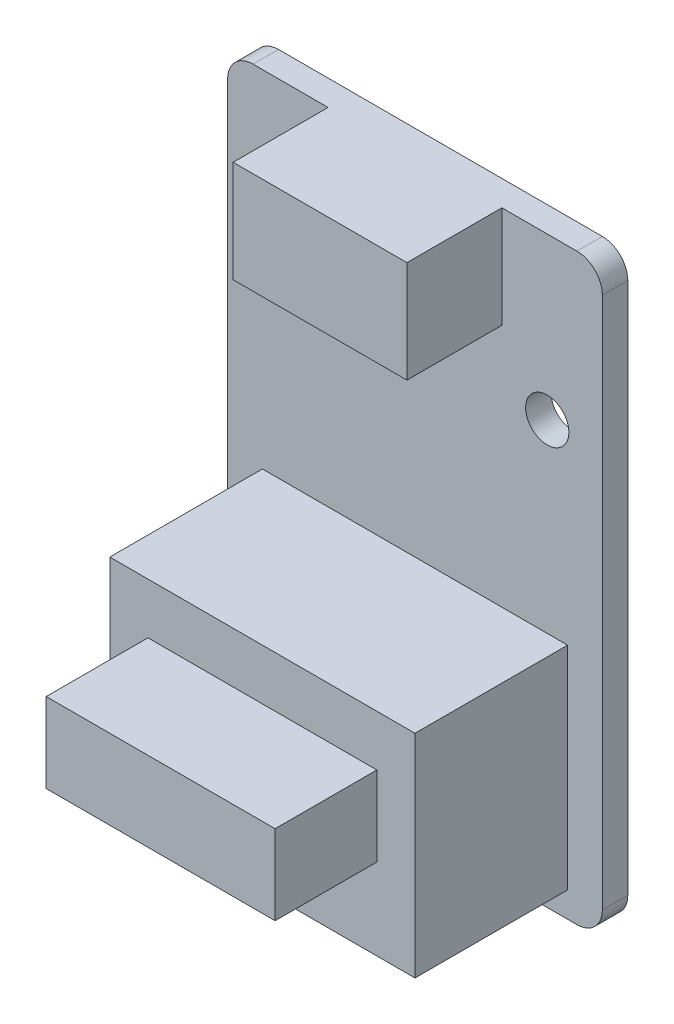
ISO-10303-21;
HEADER;
FILE_DESCRIPTION(('STEP AP214'),'2;1');
FILE_NAME('part.step','',(''),(''),'','','');
FILE_SCHEMA(('AUTOMOTIVE_DESIGN { 1 0 10303 214 1 1 1 1 }'));
ENDSEC;
DATA;
#1=APPLICATION_CONTEXT('core data for automotive mechanical design processes');
#2=APPLICATION_PROTOCOL_DEFINITION('international standard','automotive_design',2000,#1);
#3=PRODUCT_CONTEXT('',#1,'mechanical');
#4=PRODUCT('Part','Part','',(#3));
#5=PRODUCT_RELATED_PRODUCT_CATEGORY('part','',(#4));
#6=PRODUCT_DEFINITION_FORMATION('','',#4);
#7=PRODUCT_DEFINITION_CONTEXT('part definition',#1,'design');
#8=PRODUCT_DEFINITION('design','',#6,#7);
#9=PRODUCT_DEFINITION_SHAPE('','',#8);
#10=(LENGTH_UNIT() NAMED_UNIT(*) SI_UNIT(.MILLI.,.METRE.));
#11=(NAMED_UNIT(*) PLANE_ANGLE_UNIT() SI_UNIT($,.RADIAN.));
#12=(NAMED_UNIT(*) SI_UNIT($,.STERADIAN.) SOLID_ANGLE_UNIT());
#13=UNCERTAINTY_MEASURE_WITH_UNIT(LENGTH_MEASURE(1.E-05),#10,'distance_accuracy_value','');
#14=(GEOMETRIC_REPRESENTATION_CONTEXT(3) GLOBAL_UNCERTAINTY_ASSIGNED_CONTEXT((#13)) GLOBAL_UNIT_ASSIGNED_CONTEXT((#10,
#11,#12)) REPRESENTATION_CONTEXT('',''));
#15=CARTESIAN_POINT('',(0.,0.,0.));
#16=DIRECTION('',(0.,0.,1.));
#17=DIRECTION('',(1.,0.,0.));
#18=AXIS2_PLACEMENT_3D('',#15,#16,#17);
#19=CARTESIAN_POINT('',(12.3394044605913,-91.6442356585348,1.5));
#20=DIRECTION('',(0.,0.,1.));
#21=DIRECTION('',(1.,0.,0.));
#22=AXIS2_PLACEMENT_3D('',#19,#20,#21);
#23=PLANE('',#22);
#24=CARTESIAN_POINT('',(-5.01059553940872,-68.2442356585348,1.5));
#25=DIRECTION('',(0.,0.,1.));
#26=DIRECTION('',(1.,0.,0.));
#27=AXIS2_PLACEMENT_3D('',#24,#25,#26);
#28=CIRCLE('',#27,1.27499999999999);
#29=CARTESIAN_POINT('',(-3.73559553940873,-68.2442356585348,1.5));
#30=VERTEX_POINT('',#29);
#31=EDGE_CURVE('E356',#30,#30,#28,.T.);
#32=ORIENTED_EDGE('',*,*,#31,.F.);
#33=EDGE_LOOP('',(#32));
#34=FACE_BOUND('',#33,.T.);
#35=CARTESIAN_POINT('',(10.5894044605913,-68.2442356585348,1.5));
#36=DIRECTION('',(0.,0.,1.));
#37=DIRECTION('',(1.,0.,0.));
#38=AXIS2_PLACEMENT_3D('',#35,#36,#37);
#39=CIRCLE('',#38,1.27499999999999);
#40=CARTESIAN_POINT('',(11.8644044605913,-68.2442356585348,1.5));
#41=VERTEX_POINT('',#40);
#42=EDGE_CURVE('E350',#41,#41,#39,.T.);
#43=ORIENTED_EDGE('',*,*,#42,.F.);
#44=EDGE_LOOP('',(#43));
#45=FACE_BOUND('',#44,.T.);
#46=DIRECTION('',(0.,-1.,0.));
#47=VECTOR('',#46,1.);
#48=CARTESIAN_POINT('',(-6.21059553940872,-79.1442356585348,1.5));
#49=LINE('',#48,#47);
#50=CARTESIAN_POINT('',(-6.21059553940872,-79.1442356585348,1.5));
#51=VERTEX_POINT('',#50);
#52=CARTESIAN_POINT('',(-6.21059553940871,-91.6442356585348,1.5));
#53=VERTEX_POINT('',#52);
#54=EDGE_CURVE('E229',#51,#53,#49,.T.);
#55=ORIENTED_EDGE('',*,*,#54,.F.);
#56=DIRECTION('',(-1.,0.,0.));
#57=VECTOR('',#56,1.);
#58=CARTESIAN_POINT('',(-6.21059553940872,-79.1442356585348,1.5));
#59=LINE('',#58,#57);
#60=CARTESIAN_POINT('',(11.7894044605913,-79.1442356585348,1.5));
#61=VERTEX_POINT('',#60);
#62=EDGE_CURVE('E234',#61,#51,#59,.T.);
#63=ORIENTED_EDGE('',*,*,#62,.F.);
#64=DIRECTION('',(0.,1.,0.));
#65=VECTOR('',#64,1.);
#66=CARTESIAN_POINT('',(11.7894044605913,-79.1442356585348,1.5));
#67=LINE('',#66,#65);
#68=CARTESIAN_POINT('',(11.7894044605913,-91.6442356585348,1.5));
#69=VERTEX_POINT('',#68);
#70=EDGE_CURVE('E246',#69,#61,#67,.T.);
#71=ORIENTED_EDGE('',*,*,#70,.F.);
#72=DIRECTION('',(1.,0.,0.));
#73=VECTOR('',#72,1.);
#74=CARTESIAN_POINT('',(-6.21059553940871,-91.6442356585348,1.5));
#75=LINE('',#74,#73);
#76=EDGE_CURVE('E243',#53,#69,#75,.T.);
#77=ORIENTED_EDGE('',*,*,#76,.F.);
#78=EDGE_LOOP('',(#55,#63,#71,#77));
#79=FACE_BOUND('',#78,.T.);
#80=DIRECTION('',(1.,0.,0.));
#81=VECTOR('',#80,1.);
#82=CARTESIAN_POINT('',(-2.33559553940872,-64.7442356585348,1.5));
#83=LINE('',#82,#81);
#84=CARTESIAN_POINT('',(-2.33559553940872,-64.7442356585348,1.5));
#85=VERTEX_POINT('',#84);
#86=CARTESIAN_POINT('',(7.91440446059128,-64.7442356585348,1.5));
#87=VERTEX_POINT('',#86);
#88=EDGE_CURVE('E48',#85,#87,#83,.T.);
#89=ORIENTED_EDGE('',*,*,#88,.F.);
#90=DIRECTION('',(0.,-1.,0.));
#91=VECTOR('',#90,1.);
#92=CARTESIAN_POINT('',(-2.33559553940872,-58.7442356585348,1.5));
#93=LINE('',#92,#91);
#94=CARTESIAN_POINT('',(-2.33559553940872,-58.7442356585348,1.5));
#95=VERTEX_POINT('',#94);
#96=EDGE_CURVE('E190',#95,#85,#93,.T.);
#97=ORIENTED_EDGE('',*,*,#96,.F.);
#98=DIRECTION('',(-1.,0.,0.));
#99=VECTOR('',#98,1.);
#100=CARTESIAN_POINT('',(-6.76059553940871,-58.7442356585348,1.5));
#101=LINE('',#100,#99);
#102=CARTESIAN_POINT('',(-6.76059553940871,-58.7442356585348,1.5));
#103=VERTEX_POINT('',#102);
#104=EDGE_CURVE('E271',#95,#103,#101,.T.);
#105=ORIENTED_EDGE('',*,*,#104,.T.);
#106=CARTESIAN_POINT('',(-6.76059553940872,-60.2442356585348,1.5));
#107=DIRECTION('',(0.,0.,1.));
#108=DIRECTION('',(1.,0.,0.));
#109=AXIS2_PLACEMENT_3D('',#106,#107,#108);
#110=CIRCLE('',#109,1.5);
#111=CARTESIAN_POINT('',(-8.26059553940872,-60.2442356585348,1.5));
#112=VERTEX_POINT('',#111);
#113=EDGE_CURVE('E274',#103,#112,#110,.T.);
#114=ORIENTED_EDGE('',*,*,#113,.T.);
#115=DIRECTION('',(0.,-1.,0.));
#116=VECTOR('',#115,1.);
#117=CARTESIAN_POINT('',(-8.26059553940872,-60.2442356585348,1.5));
#118=LINE('',#117,#116);
#119=CARTESIAN_POINT('',(-8.26059553940872,-91.6442356585348,1.5));
#120=VERTEX_POINT('',#119);
#121=EDGE_CURVE('E276',#112,#120,#118,.T.);
#122=ORIENTED_EDGE('',*,*,#121,.T.);
#123=CARTESIAN_POINT('',(-6.76059553940872,-91.6442356585348,1.5));
#124=DIRECTION('',(0.,0.,1.));
#125=DIRECTION('',(1.,0.,0.));
#126=AXIS2_PLACEMENT_3D('',#123,#124,#125);
#127=CIRCLE('',#126,1.5);
#128=CARTESIAN_POINT('',(-6.76059553940871,-93.1442356585348,1.5));
#129=VERTEX_POINT('',#128);
#130=EDGE_CURVE('E278',#120,#129,#127,.T.);
#131=ORIENTED_EDGE('',*,*,#130,.T.);
#132=DIRECTION('',(1.,0.,0.));
#133=VECTOR('',#132,1.);
#134=CARTESIAN_POINT('',(-6.76059553940871,-93.1442356585348,1.5));
#135=LINE('',#134,#133);
#136=CARTESIAN_POINT('',(12.3394044605913,-93.1442356585348,1.5));
#137=VERTEX_POINT('',#136);
#138=EDGE_CURVE('E280',#129,#137,#135,.T.);
#139=ORIENTED_EDGE('',*,*,#138,.T.);
#140=CARTESIAN_POINT('',(12.3394044605913,-91.6442356585348,1.5));
#141=DIRECTION('',(0.,0.,1.));
#142=DIRECTION('',(1.,0.,0.));
#143=AXIS2_PLACEMENT_3D('',#140,#141,#142);
#144=CIRCLE('',#143,1.5);
#145=CARTESIAN_POINT('',(13.8394044605913,-91.6442356585348,1.5));
#146=VERTEX_POINT('',#145);
#147=EDGE_CURVE('E263',#137,#146,#144,.T.);
#148=ORIENTED_EDGE('',*,*,#147,.T.);
#149=DIRECTION('',(0.,1.,0.));
#150=VECTOR('',#149,1.);
#151=CARTESIAN_POINT('',(13.8394044605913,-60.2442356585348,1.5));
#152=LINE('',#151,#150);
#153=CARTESIAN_POINT('',(13.8394044605913,-60.2442356585348,1.5));
#154=VERTEX_POINT('',#153);
#155=EDGE_CURVE('E266',#146,#154,#152,.T.);
#156=ORIENTED_EDGE('',*,*,#155,.T.);
#157=CARTESIAN_POINT('',(12.3394044605913,-60.2442356585348,1.5));
#158=DIRECTION('',(0.,0.,1.));
#159=DIRECTION('',(-1.,0.,0.));
#160=AXIS2_PLACEMENT_3D('',#157,#158,#159);
#161=CIRCLE('',#160,1.5);
#162=CARTESIAN_POINT('',(12.3394044605913,-58.7442356585348,1.5));
#163=VERTEX_POINT('',#162);
#164=EDGE_CURVE('E269',#154,#163,#161,.T.);
#165=ORIENTED_EDGE('',*,*,#164,.T.);
#166=CARTESIAN_POINT('',(7.91440446059128,-58.7442356585348,1.5));
#167=VERTEX_POINT('',#166);
#168=EDGE_CURVE('E272',#163,#167,#101,.T.);
#169=ORIENTED_EDGE('',*,*,#168,.T.);
#170=DIRECTION('',(0.,1.,0.));
#171=VECTOR('',#170,1.);
#172=CARTESIAN_POINT('',(7.91440446059128,-58.7442356585348,1.5));
#173=LINE('',#172,#171);
#174=EDGE_CURVE('E53',#87,#167,#173,.T.);
#175=ORIENTED_EDGE('',*,*,#174,.F.);
#176=EDGE_LOOP('',(#89,#97,#105,#114,#122,#131,#139,#148,#156,#165,#169,#175));
#177=FACE_BOUND('',#176,.T.);
#178=ADVANCED_FACE('F33',(#34,#45,#79,#177),#23,.T.);
#179=CARTESIAN_POINT('',(12.3394044605913,-91.6442356585348,1.5));
#180=DIRECTION('',(0.,0.,-1.));
#181=DIRECTION('',(-1.,0.,0.));
#182=AXIS2_PLACEMENT_3D('',#179,#180,#181);
#183=CYLINDRICAL_SURFACE('',#182,1.5);
#184=CARTESIAN_POINT('',(12.3394044605913,-91.6442356585348,0.));
#185=DIRECTION('',(0.,0.,1.));
#186=DIRECTION('',(1.,0.,0.));
#187=AXIS2_PLACEMENT_3D('',#184,#185,#186);
#188=CIRCLE('',#187,1.5);
#189=CARTESIAN_POINT('',(12.3394044605913,-93.1442356585348,0.));
#190=VERTEX_POINT('',#189);
#191=CARTESIAN_POINT('',(13.8394044605913,-91.6442356585348,0.));
#192=VERTEX_POINT('',#191);
#193=EDGE_CURVE('E262',#190,#192,#188,.T.);
#194=ORIENTED_EDGE('',*,*,#193,.T.);
#195=DIRECTION('',(0.,0.,-1.));
#196=VECTOR('',#195,1.);
#197=CARTESIAN_POINT('',(13.8394044605913,-91.6442356585348,1.5));
#198=LINE('',#197,#196);
#199=EDGE_CURVE('E11',#146,#192,#198,.T.);
#200=ORIENTED_EDGE('',*,*,#199,.F.);
#201=ORIENTED_EDGE('',*,*,#147,.F.);
#202=DIRECTION('',(0.,0.,-1.));
#203=VECTOR('',#202,1.);
#204=CARTESIAN_POINT('',(12.3394044605913,-93.1442356585348,1.5));
#205=LINE('',#204,#203);
#206=EDGE_CURVE('E282',#137,#190,#205,.T.);
#207=ORIENTED_EDGE('',*,*,#206,.T.);
#208=EDGE_LOOP('',(#194,#200,#201,#207));
#209=FACE_BOUND('',#208,.T.);
#210=ADVANCED_FACE('F35',(#209),#183,.T.);
#211=CARTESIAN_POINT('',(13.8394044605913,-60.2442356585348,1.5));
#212=DIRECTION('',(-1.,0.,0.));
#213=DIRECTION('',(0.,-1.,0.));
#214=AXIS2_PLACEMENT_3D('',#211,#212,#213);
#215=PLANE('',#214);
#216=DIRECTION('',(0.,1.,0.));
#217=VECTOR('',#216,1.);
#218=CARTESIAN_POINT('',(13.8394044605913,-60.2442356585348,0.));
#219=LINE('',#218,#217);
#220=CARTESIAN_POINT('',(13.8394044605913,-60.2442356585348,0.));
#221=VERTEX_POINT('',#220);
#222=EDGE_CURVE('E285',#192,#221,#219,.T.);
#223=ORIENTED_EDGE('',*,*,#222,.T.);
#224=DIRECTION('',(0.,0.,-1.));
#225=VECTOR('',#224,1.);
#226=CARTESIAN_POINT('',(13.8394044605913,-60.2442356585348,1.5));
#227=LINE('',#226,#225);
#228=EDGE_CURVE('E41',#154,#221,#227,.T.);
#229=ORIENTED_EDGE('',*,*,#228,.F.);
#230=ORIENTED_EDGE('',*,*,#155,.F.);
#231=ORIENTED_EDGE('',*,*,#199,.T.);
#232=EDGE_LOOP('',(#223,#229,#230,#231));
#233=FACE_BOUND('',#232,.T.);
#234=ADVANCED_FACE('F414',(#233),#215,.F.);
#235=CARTESIAN_POINT('',(12.3394044605913,-60.2442356585348,1.5));
#236=DIRECTION('',(0.,0.,-1.));
#237=DIRECTION('',(-1.,0.,0.));
#238=AXIS2_PLACEMENT_3D('',#235,#236,#237);
#239=CYLINDRICAL_SURFACE('',#238,1.5);
#240=CARTESIAN_POINT('',(12.3394044605913,-60.2442356585348,0.));
#241=DIRECTION('',(0.,0.,1.));
#242=DIRECTION('',(-1.,0.,0.));
#243=AXIS2_PLACEMENT_3D('',#240,#241,#242);
#244=CIRCLE('',#243,1.5);
#245=CARTESIAN_POINT('',(12.3394044605913,-58.7442356585348,0.));
#246=VERTEX_POINT('',#245);
#247=EDGE_CURVE('E287',#221,#246,#244,.T.);
#248=ORIENTED_EDGE('',*,*,#247,.T.);
#249=DIRECTION('',(0.,0.,-1.));
#250=VECTOR('',#249,1.);
#251=CARTESIAN_POINT('',(12.3394044605913,-58.7442356585348,1.5));
#252=LINE('',#251,#250);
#253=EDGE_CURVE('E312',#163,#246,#252,.T.);
#254=ORIENTED_EDGE('',*,*,#253,.F.);
#255=ORIENTED_EDGE('',*,*,#164,.F.);
#256=ORIENTED_EDGE('',*,*,#228,.T.);
#257=EDGE_LOOP('',(#248,#254,#255,#256));
#258=FACE_BOUND('',#257,.T.);
#259=ADVANCED_FACE('F319',(#258),#239,.T.);
#260=CARTESIAN_POINT('',(-6.76059553940871,-58.7442356585348,1.5));
#261=DIRECTION('',(0.,-1.,0.));
#262=DIRECTION('',(0.,0.,-1.));
#263=AXIS2_PLACEMENT_3D('',#260,#261,#262);
#264=PLANE('',#263);
#265=DIRECTION('',(-1.,0.,0.));
#266=VECTOR('',#265,1.);
#267=CARTESIAN_POINT('',(-6.76059553940871,-58.7442356585348,0.));
#268=LINE('',#267,#266);
#269=CARTESIAN_POINT('',(-6.76059553940871,-58.7442356585348,0.));
#270=VERTEX_POINT('',#269);
#271=EDGE_CURVE('E289',#246,#270,#268,.T.);
#272=ORIENTED_EDGE('',*,*,#271,.T.);
#273=DIRECTION('',(0.,0.,-1.));
#274=VECTOR('',#273,1.);
#275=CARTESIAN_POINT('',(-6.76059553940871,-58.7442356585348,1.5));
#276=LINE('',#275,#274);
#277=EDGE_CURVE('E309',#103,#270,#276,.T.);
#278=ORIENTED_EDGE('',*,*,#277,.F.);
#279=ORIENTED_EDGE('',*,*,#104,.F.);
#280=DIRECTION('',(0.,0.,-1.));
#281=VECTOR('',#280,1.);
#282=CARTESIAN_POINT('',(-2.33559553940872,-58.7442356585348,7.1));
#283=LINE('',#282,#281);
#284=CARTESIAN_POINT('',(-2.33559553940872,-58.7442356585348,7.1));
#285=VERTEX_POINT('',#284);
#286=EDGE_CURVE('E338',#285,#95,#283,.T.);
#287=ORIENTED_EDGE('',*,*,#286,.F.);
#288=DIRECTION('',(-1.,0.,0.));
#289=VECTOR('',#288,1.);
#290=CARTESIAN_POINT('',(-2.33559553940872,-58.7442356585348,7.1));
#291=LINE('',#290,#289);
#292=CARTESIAN_POINT('',(7.91440446059128,-58.7442356585348,7.1));
#293=VERTEX_POINT('',#292);
#294=EDGE_CURVE('E184',#293,#285,#291,.T.);
#295=ORIENTED_EDGE('',*,*,#294,.F.);
#296=DIRECTION('',(0.,0.,-1.));
#297=VECTOR('',#296,1.);
#298=CARTESIAN_POINT('',(7.91440446059128,-58.7442356585348,7.1));
#299=LINE('',#298,#297);
#300=EDGE_CURVE('E196',#293,#167,#299,.T.);
#301=ORIENTED_EDGE('',*,*,#300,.T.);
#302=ORIENTED_EDGE('',*,*,#168,.F.);
#303=ORIENTED_EDGE('',*,*,#253,.T.);
#304=EDGE_LOOP('',(#272,#278,#279,#287,#295,#301,#302,#303));
#305=FACE_BOUND('',#304,.T.);
#306=ADVANCED_FACE('F330',(#305),#264,.F.);
#307=CARTESIAN_POINT('',(-6.76059553940872,-60.2442356585348,1.5));
#308=DIRECTION('',(0.,0.,-1.));
#309=DIRECTION('',(-1.,0.,0.));
#310=AXIS2_PLACEMENT_3D('',#307,#308,#309);
#311=CYLINDRICAL_SURFACE('',#310,1.5);
#312=CARTESIAN_POINT('',(-6.76059553940872,-60.2442356585348,0.));
#313=DIRECTION('',(0.,0.,1.));
#314=DIRECTION('',(1.,0.,0.));
#315=AXIS2_PLACEMENT_3D('',#312,#313,#314);
#316=CIRCLE('',#315,1.5);
#317=CARTESIAN_POINT('',(-8.26059553940872,-60.2442356585348,0.));
#318=VERTEX_POINT('',#317);
#319=EDGE_CURVE('E291',#270,#318,#316,.T.);
#320=ORIENTED_EDGE('',*,*,#319,.T.);
#321=DIRECTION('',(0.,0.,-1.));
#322=VECTOR('',#321,1.);
#323=CARTESIAN_POINT('',(-8.26059553940872,-60.2442356585348,1.5));
#324=LINE('',#323,#322);
#325=EDGE_CURVE('E306',#112,#318,#324,.T.);
#326=ORIENTED_EDGE('',*,*,#325,.F.);
#327=ORIENTED_EDGE('',*,*,#113,.F.);
#328=ORIENTED_EDGE('',*,*,#277,.T.);
#329=EDGE_LOOP('',(#320,#326,#327,#328));
#330=FACE_BOUND('',#329,.T.);
#331=ADVANCED_FACE('F334',(#330),#311,.T.);
#332=CARTESIAN_POINT('',(-8.26059553940872,-60.2442356585348,1.5));
#333=DIRECTION('',(1.,0.,0.));
#334=DIRECTION('',(0.,1.,0.));
#335=AXIS2_PLACEMENT_3D('',#332,#333,#334);
#336=PLANE('',#335);
#337=DIRECTION('',(0.,-1.,0.));
#338=VECTOR('',#337,1.);
#339=CARTESIAN_POINT('',(-8.26059553940872,-60.2442356585348,0.));
#340=LINE('',#339,#338);
#341=CARTESIAN_POINT('',(-8.26059553940872,-91.6442356585348,0.));
#342=VERTEX_POINT('',#341);
#343=EDGE_CURVE('E293',#318,#342,#340,.T.);
#344=ORIENTED_EDGE('',*,*,#343,.T.);
#345=DIRECTION('',(0.,0.,-1.));
#346=VECTOR('',#345,1.);
#347=CARTESIAN_POINT('',(-8.26059553940872,-91.6442356585348,1.5));
#348=LINE('',#347,#346);
#349=EDGE_CURVE('E303',#120,#342,#348,.T.);
#350=ORIENTED_EDGE('',*,*,#349,.F.);
#351=ORIENTED_EDGE('',*,*,#121,.F.);
#352=ORIENTED_EDGE('',*,*,#325,.T.);
#353=EDGE_LOOP('',(#344,#350,#351,#352));
#354=FACE_BOUND('',#353,.T.);
#355=ADVANCED_FACE('F404',(#354),#336,.F.);
#356=CARTESIAN_POINT('',(-6.76059553940872,-91.6442356585348,1.5));
#357=DIRECTION('',(0.,0.,-1.));
#358=DIRECTION('',(-1.,0.,0.));
#359=AXIS2_PLACEMENT_3D('',#356,#357,#358);
#360=CYLINDRICAL_SURFACE('',#359,1.5);
#361=CARTESIAN_POINT('',(-6.76059553940872,-91.6442356585348,0.));
#362=DIRECTION('',(0.,0.,1.));
#363=DIRECTION('',(1.,0.,0.));
#364=AXIS2_PLACEMENT_3D('',#361,#362,#363);
#365=CIRCLE('',#364,1.5);
#366=CARTESIAN_POINT('',(-6.76059553940871,-93.1442356585348,0.));
#367=VERTEX_POINT('',#366);
#368=EDGE_CURVE('E295',#342,#367,#365,.T.);
#369=ORIENTED_EDGE('',*,*,#368,.T.);
#370=DIRECTION('',(0.,0.,-1.));
#371=VECTOR('',#370,1.);
#372=CARTESIAN_POINT('',(-6.76059553940871,-93.1442356585348,1.5));
#373=LINE('',#372,#371);
#374=EDGE_CURVE('E300',#129,#367,#373,.T.);
#375=ORIENTED_EDGE('',*,*,#374,.F.);
#376=ORIENTED_EDGE('',*,*,#130,.F.);
#377=ORIENTED_EDGE('',*,*,#349,.T.);
#378=EDGE_LOOP('',(#369,#375,#376,#377));
#379=FACE_BOUND('',#378,.T.);
#380=ADVANCED_FACE('F400',(#379),#360,.T.);
#381=CARTESIAN_POINT('',(-6.76059553940871,-93.1442356585348,1.5));
#382=DIRECTION('',(0.,1.,0.));
#383=DIRECTION('',(0.,0.,1.));
#384=AXIS2_PLACEMENT_3D('',#381,#382,#383);
#385=PLANE('',#384);
#386=DIRECTION('',(1.,0.,0.));
#387=VECTOR('',#386,1.);
#388=CARTESIAN_POINT('',(-6.76059553940871,-93.1442356585348,0.));
#389=LINE('',#388,#387);
#390=EDGE_CURVE('E267',#367,#190,#389,.T.);
#391=ORIENTED_EDGE('',*,*,#390,.T.);
#392=ORIENTED_EDGE('',*,*,#206,.F.);
#393=ORIENTED_EDGE('',*,*,#138,.F.);
#394=ORIENTED_EDGE('',*,*,#374,.T.);
#395=EDGE_LOOP('',(#391,#392,#393,#394));
#396=FACE_BOUND('',#395,.T.);
#397=ADVANCED_FACE('F396',(#396),#385,.F.);
#398=CARTESIAN_POINT('',(12.3394044605913,-91.6442356585348,0.));
#399=DIRECTION('',(0.,0.,1.));
#400=DIRECTION('',(1.,0.,0.));
#401=AXIS2_PLACEMENT_3D('',#398,#399,#400);
#402=PLANE('',#401);
#403=CARTESIAN_POINT('',(-5.01059553940872,-68.2442356585348,0.));
#404=DIRECTION('',(0.,0.,1.));
#405=DIRECTION('',(1.,0.,0.));
#406=AXIS2_PLACEMENT_3D('',#403,#404,#405);
#407=CIRCLE('',#406,1.275);
#408=CARTESIAN_POINT('',(-3.73559553940872,-68.2442356585348,0.));
#409=VERTEX_POINT('',#408);
#410=EDGE_CURVE('E353',#409,#409,#407,.T.);
#411=ORIENTED_EDGE('',*,*,#410,.T.);
#412=EDGE_LOOP('',(#411));
#413=FACE_BOUND('',#412,.T.);
#414=CARTESIAN_POINT('',(10.5894044605913,-68.2442356585348,0.));
#415=DIRECTION('',(0.,0.,1.));
#416=DIRECTION('',(1.,0.,0.));
#417=AXIS2_PLACEMENT_3D('',#414,#415,#416);
#418=CIRCLE('',#417,1.275);
#419=CARTESIAN_POINT('',(11.8644044605913,-68.2442356585348,0.));
#420=VERTEX_POINT('',#419);
#421=EDGE_CURVE('E345',#420,#420,#418,.T.);
#422=ORIENTED_EDGE('',*,*,#421,.T.);
#423=EDGE_LOOP('',(#422));
#424=FACE_BOUND('',#423,.T.);
#425=ORIENTED_EDGE('',*,*,#193,.F.);
#426=ORIENTED_EDGE('',*,*,#390,.F.);
#427=ORIENTED_EDGE('',*,*,#368,.F.);
#428=ORIENTED_EDGE('',*,*,#343,.F.);
#429=ORIENTED_EDGE('',*,*,#319,.F.);
#430=ORIENTED_EDGE('',*,*,#271,.F.);
#431=ORIENTED_EDGE('',*,*,#247,.F.);
#432=ORIENTED_EDGE('',*,*,#222,.F.);
#433=EDGE_LOOP('',(#425,#426,#427,#428,#429,#430,#431,#432));
#434=FACE_BOUND('',#433,.T.);
#435=ADVANCED_FACE('F325',(#413,#424,#434),#402,.F.);
#436=CARTESIAN_POINT('',(-6.21059553940872,-79.1442356585348,10.5));
#437=DIRECTION('',(1.,0.,0.));
#438=DIRECTION('',(0.,1.,0.));
#439=AXIS2_PLACEMENT_3D('',#436,#437,#438);
#440=PLANE('',#439);
#441=ORIENTED_EDGE('',*,*,#54,.T.);
#442=DIRECTION('',(0.,0.,-1.));
#443=VECTOR('',#442,1.);
#444=CARTESIAN_POINT('',(-6.21059553940871,-91.6442356585348,10.5));
#445=LINE('',#444,#443);
#446=CARTESIAN_POINT('',(-6.21059553940871,-91.6442356585348,10.5));
#447=VERTEX_POINT('',#446);
#448=EDGE_CURVE('E259',#447,#53,#445,.T.);
#449=ORIENTED_EDGE('',*,*,#448,.F.);
#450=DIRECTION('',(0.,-1.,0.));
#451=VECTOR('',#450,1.);
#452=CARTESIAN_POINT('',(-6.21059553940872,-79.1442356585348,10.5));
#453=LINE('',#452,#451);
#454=CARTESIAN_POINT('',(-6.21059553940872,-79.1442356585348,10.5));
#455=VERTEX_POINT('',#454);
#456=EDGE_CURVE('E230',#455,#447,#453,.T.);
#457=ORIENTED_EDGE('',*,*,#456,.F.);
#458=DIRECTION('',(0.,0.,-1.));
#459=VECTOR('',#458,1.);
#460=CARTESIAN_POINT('',(-6.21059553940872,-79.1442356585348,10.5));
#461=LINE('',#460,#459);
#462=EDGE_CURVE('E240',#455,#51,#461,.T.);
#463=ORIENTED_EDGE('',*,*,#462,.T.);
#464=EDGE_LOOP('',(#441,#449,#457,#463));
#465=FACE_BOUND('',#464,.T.);
#466=ADVANCED_FACE('F375',(#465),#440,.F.);
#467=CARTESIAN_POINT('',(-6.21059553940871,-91.6442356585348,10.5));
#468=DIRECTION('',(0.,1.,0.));
#469=DIRECTION('',(0.,0.,1.));
#470=AXIS2_PLACEMENT_3D('',#467,#468,#469);
#471=PLANE('',#470);
#472=ORIENTED_EDGE('',*,*,#76,.T.);
#473=DIRECTION('',(0.,0.,-1.));
#474=VECTOR('',#473,1.);
#475=CARTESIAN_POINT('',(11.7894044605913,-91.6442356585348,10.5));
#476=LINE('',#475,#474);
#477=CARTESIAN_POINT('',(11.7894044605913,-91.6442356585348,10.5));
#478=VERTEX_POINT('',#477);
#479=EDGE_CURVE('E256',#478,#69,#476,.T.);
#480=ORIENTED_EDGE('',*,*,#479,.F.);
#481=DIRECTION('',(1.,0.,0.));
#482=VECTOR('',#481,1.);
#483=CARTESIAN_POINT('',(-6.21059553940871,-91.6442356585348,10.5));
#484=LINE('',#483,#482);
#485=EDGE_CURVE('E233',#447,#478,#484,.T.);
#486=ORIENTED_EDGE('',*,*,#485,.F.);
#487=ORIENTED_EDGE('',*,*,#448,.T.);
#488=EDGE_LOOP('',(#472,#480,#486,#487));
#489=FACE_BOUND('',#488,.T.);
#490=ADVANCED_FACE('F383',(#489),#471,.F.);
#491=CARTESIAN_POINT('',(11.7894044605913,-79.1442356585348,10.5));
#492=DIRECTION('',(-1.,0.,0.));
#493=DIRECTION('',(0.,-1.,0.));
#494=AXIS2_PLACEMENT_3D('',#491,#492,#493);
#495=PLANE('',#494);
#496=ORIENTED_EDGE('',*,*,#70,.T.);
#497=DIRECTION('',(0.,0.,-1.));
#498=VECTOR('',#497,1.);
#499=CARTESIAN_POINT('',(11.7894044605913,-79.1442356585348,10.5));
#500=LINE('',#499,#498);
#501=CARTESIAN_POINT('',(11.7894044605913,-79.1442356585348,10.5));
#502=VERTEX_POINT('',#501);
#503=EDGE_CURVE('E253',#502,#61,#500,.T.);
#504=ORIENTED_EDGE('',*,*,#503,.F.);
#505=DIRECTION('',(0.,1.,0.));
#506=VECTOR('',#505,1.);
#507=CARTESIAN_POINT('',(11.7894044605913,-79.1442356585348,10.5));
#508=LINE('',#507,#506);
#509=EDGE_CURVE('E236',#478,#502,#508,.T.);
#510=ORIENTED_EDGE('',*,*,#509,.F.);
#511=ORIENTED_EDGE('',*,*,#479,.T.);
#512=EDGE_LOOP('',(#496,#504,#510,#511));
#513=FACE_BOUND('',#512,.T.);
#514=ADVANCED_FACE('F381',(#513),#495,.F.);
#515=CARTESIAN_POINT('',(-6.21059553940872,-79.1442356585348,10.5));
#516=DIRECTION('',(0.,-1.,0.));
#517=DIRECTION('',(0.,0.,-1.));
#518=AXIS2_PLACEMENT_3D('',#515,#516,#517);
#519=PLANE('',#518);
#520=ORIENTED_EDGE('',*,*,#62,.T.);
#521=ORIENTED_EDGE('',*,*,#462,.F.);
#522=DIRECTION('',(-1.,0.,0.));
#523=VECTOR('',#522,1.);
#524=CARTESIAN_POINT('',(-6.21059553940872,-79.1442356585348,10.5));
#525=LINE('',#524,#523);
#526=EDGE_CURVE('E238',#502,#455,#525,.T.);
#527=ORIENTED_EDGE('',*,*,#526,.F.);
#528=ORIENTED_EDGE('',*,*,#503,.T.);
#529=EDGE_LOOP('',(#520,#521,#527,#528));
#530=FACE_BOUND('',#529,.T.);
#531=ADVANCED_FACE('F371',(#530),#519,.F.);
#532=CARTESIAN_POINT('',(0.,0.,10.5));
#533=DIRECTION('',(0.,0.,1.));
#534=DIRECTION('',(1.,0.,0.));
#535=AXIS2_PLACEMENT_3D('',#532,#533,#534);
#536=PLANE('',#535);
#537=DIRECTION('',(0.,-1.,0.));
#538=VECTOR('',#537,1.);
#539=CARTESIAN_POINT('',(-3.96059553940872,-82.1442356585348,10.5));
#540=LINE('',#539,#538);
#541=CARTESIAN_POINT('',(-3.96059553940872,-82.1442356585348,10.5));
#542=VERTEX_POINT('',#541);
#543=CARTESIAN_POINT('',(-3.96059553940872,-86.8442356585348,10.5));
#544=VERTEX_POINT('',#543);
#545=EDGE_CURVE('E191',#542,#544,#540,.T.);
#546=ORIENTED_EDGE('',*,*,#545,.F.);
#547=DIRECTION('',(-1.,0.,0.));
#548=VECTOR('',#547,1.);
#549=CARTESIAN_POINT('',(-3.96059553940872,-82.1442356585348,10.5));
#550=LINE('',#549,#548);
#551=CARTESIAN_POINT('',(9.53940446059128,-82.1442356585348,10.5));
#552=VERTEX_POINT('',#551);
#553=EDGE_CURVE('E204',#552,#542,#550,.T.);
#554=ORIENTED_EDGE('',*,*,#553,.F.);
#555=DIRECTION('',(0.,1.,0.));
#556=VECTOR('',#555,1.);
#557=CARTESIAN_POINT('',(9.53940446059128,-82.1442356585348,10.5));
#558=LINE('',#557,#556);
#559=CARTESIAN_POINT('',(9.53940446059128,-86.8442356585348,10.5));
#560=VERTEX_POINT('',#559);
#561=EDGE_CURVE('E213',#560,#552,#558,.T.);
#562=ORIENTED_EDGE('',*,*,#561,.F.);
#563=DIRECTION('',(1.,0.,0.));
#564=VECTOR('',#563,1.);
#565=CARTESIAN_POINT('',(-3.96059553940872,-86.8442356585348,10.5));
#566=LINE('',#565,#564);
#567=EDGE_CURVE('E194',#544,#560,#566,.T.);
#568=ORIENTED_EDGE('',*,*,#567,.F.);
#569=EDGE_LOOP('',(#546,#554,#562,#568));
#570=FACE_BOUND('',#569,.T.);
#571=ORIENTED_EDGE('',*,*,#456,.T.);
#572=ORIENTED_EDGE('',*,*,#485,.T.);
#573=ORIENTED_EDGE('',*,*,#509,.T.);
#574=ORIENTED_EDGE('',*,*,#526,.T.);
#575=EDGE_LOOP('',(#571,#572,#573,#574));
#576=FACE_BOUND('',#575,.T.);
#577=ADVANCED_FACE('F377',(#570,#576),#536,.T.);
#578=CARTESIAN_POINT('',(-3.96059553940872,-82.1442356585348,16.5));
#579=DIRECTION('',(1.,0.,0.));
#580=DIRECTION('',(0.,0.,-1.));
#581=AXIS2_PLACEMENT_3D('',#578,#579,#580);
#582=PLANE('',#581);
#583=ORIENTED_EDGE('',*,*,#545,.T.);
#584=DIRECTION('',(0.,0.,-1.));
#585=VECTOR('',#584,1.);
#586=CARTESIAN_POINT('',(-3.96059553940872,-86.8442356585348,16.5));
#587=LINE('',#586,#585);
#588=CARTESIAN_POINT('',(-3.96059553940872,-86.8442356585348,16.5));
#589=VERTEX_POINT('',#588);
#590=EDGE_CURVE('E226',#589,#544,#587,.T.);
#591=ORIENTED_EDGE('',*,*,#590,.F.);
#592=DIRECTION('',(0.,-1.,0.));
#593=VECTOR('',#592,1.);
#594=CARTESIAN_POINT('',(-3.96059553940872,-82.1442356585348,16.5));
#595=LINE('',#594,#593);
#596=CARTESIAN_POINT('',(-3.96059553940872,-82.1442356585348,16.5));
#597=VERTEX_POINT('',#596);
#598=EDGE_CURVE('E200',#597,#589,#595,.T.);
#599=ORIENTED_EDGE('',*,*,#598,.F.);
#600=DIRECTION('',(0.,0.,-1.));
#601=VECTOR('',#600,1.);
#602=CARTESIAN_POINT('',(-3.96059553940872,-82.1442356585348,16.5));
#603=LINE('',#602,#601);
#604=EDGE_CURVE('E209',#597,#542,#603,.T.);
#605=ORIENTED_EDGE('',*,*,#604,.T.);
#606=EDGE_LOOP('',(#583,#591,#599,#605));
#607=FACE_BOUND('',#606,.T.);
#608=ADVANCED_FACE('F459',(#607),#582,.F.);
#609=CARTESIAN_POINT('',(-3.96059553940872,-86.8442356585348,16.5));
#610=DIRECTION('',(0.,1.,0.));
#611=DIRECTION('',(0.,0.,1.));
#612=AXIS2_PLACEMENT_3D('',#609,#610,#611);
#613=PLANE('',#612);
#614=ORIENTED_EDGE('',*,*,#567,.T.);
#615=DIRECTION('',(0.,0.,-1.));
#616=VECTOR('',#615,1.);
#617=CARTESIAN_POINT('',(9.53940446059128,-86.8442356585348,16.5));
#618=LINE('',#617,#616);
#619=CARTESIAN_POINT('',(9.53940446059128,-86.8442356585348,16.5));
#620=VERTEX_POINT('',#619);
#621=EDGE_CURVE('E223',#620,#560,#618,.T.);
#622=ORIENTED_EDGE('',*,*,#621,.F.);
#623=DIRECTION('',(1.,0.,0.));
#624=VECTOR('',#623,1.);
#625=CARTESIAN_POINT('',(-3.96059553940872,-86.8442356585348,16.5));
#626=LINE('',#625,#624);
#627=EDGE_CURVE('E203',#589,#620,#626,.T.);
#628=ORIENTED_EDGE('',*,*,#627,.F.);
#629=ORIENTED_EDGE('',*,*,#590,.T.);
#630=EDGE_LOOP('',(#614,#622,#628,#629));
#631=FACE_BOUND('',#630,.T.);
#632=ADVANCED_FACE('F455',(#631),#613,.F.);
#633=CARTESIAN_POINT('',(9.53940446059128,-82.1442356585348,16.5));
#634=DIRECTION('',(-1.,0.,0.));
#635=DIRECTION('',(0.,0.,1.));
#636=AXIS2_PLACEMENT_3D('',#633,#634,#635);
#637=PLANE('',#636);
#638=ORIENTED_EDGE('',*,*,#561,.T.);
#639=DIRECTION('',(0.,0.,-1.));
#640=VECTOR('',#639,1.);
#641=CARTESIAN_POINT('',(9.53940446059128,-82.1442356585348,16.5));
#642=LINE('',#641,#640);
#643=CARTESIAN_POINT('',(9.53940446059128,-82.1442356585348,16.5));
#644=VERTEX_POINT('',#643);
#645=EDGE_CURVE('E220',#644,#552,#642,.T.);
#646=ORIENTED_EDGE('',*,*,#645,.F.);
#647=DIRECTION('',(0.,1.,0.));
#648=VECTOR('',#647,1.);
#649=CARTESIAN_POINT('',(9.53940446059128,-82.1442356585348,16.5));
#650=LINE('',#649,#648);
#651=EDGE_CURVE('E206',#620,#644,#650,.T.);
#652=ORIENTED_EDGE('',*,*,#651,.F.);
#653=ORIENTED_EDGE('',*,*,#621,.T.);
#654=EDGE_LOOP('',(#638,#646,#652,#653));
#655=FACE_BOUND('',#654,.T.);
#656=ADVANCED_FACE('F451',(#655),#637,.F.);
#657=CARTESIAN_POINT('',(-3.96059553940872,-82.1442356585348,16.5));
#658=DIRECTION('',(0.,-1.,0.));
#659=DIRECTION('',(0.,0.,-1.));
#660=AXIS2_PLACEMENT_3D('',#657,#658,#659);
#661=PLANE('',#660);
#662=ORIENTED_EDGE('',*,*,#553,.T.);
#663=ORIENTED_EDGE('',*,*,#604,.F.);
#664=DIRECTION('',(-1.,0.,0.));
#665=VECTOR('',#664,1.);
#666=CARTESIAN_POINT('',(-3.96059553940872,-82.1442356585348,16.5));
#667=LINE('',#666,#665);
#668=EDGE_CURVE('E208',#644,#597,#667,.T.);
#669=ORIENTED_EDGE('',*,*,#668,.F.);
#670=ORIENTED_EDGE('',*,*,#645,.T.);
#671=EDGE_LOOP('',(#662,#663,#669,#670));
#672=FACE_BOUND('',#671,.T.);
#673=ADVANCED_FACE('F447',(#672),#661,.F.);
#674=CARTESIAN_POINT('',(0.,0.,16.5));
#675=DIRECTION('',(0.,0.,1.));
#676=DIRECTION('',(1.,0.,0.));
#677=AXIS2_PLACEMENT_3D('',#674,#675,#676);
#678=PLANE('',#677);
#679=ORIENTED_EDGE('',*,*,#598,.T.);
#680=ORIENTED_EDGE('',*,*,#627,.T.);
#681=ORIENTED_EDGE('',*,*,#651,.T.);
#682=ORIENTED_EDGE('',*,*,#668,.T.);
#683=EDGE_LOOP('',(#679,#680,#681,#682));
#684=FACE_BOUND('',#683,.T.);
#685=ADVANCED_FACE('F444',(#684),#678,.T.);
#686=CARTESIAN_POINT('',(-2.33559553940872,-58.7442356585348,7.1));
#687=DIRECTION('',(1.,0.,0.));
#688=DIRECTION('',(0.,1.,0.));
#689=AXIS2_PLACEMENT_3D('',#686,#687,#688);
#690=PLANE('',#689);
#691=ORIENTED_EDGE('',*,*,#96,.T.);
#692=DIRECTION('',(0.,0.,-1.));
#693=VECTOR('',#692,1.);
#694=CARTESIAN_POINT('',(-2.33559553940872,-64.7442356585348,7.1));
#695=LINE('',#694,#693);
#696=CARTESIAN_POINT('',(-2.33559553940872,-64.7442356585348,7.1));
#697=VERTEX_POINT('',#696);
#698=EDGE_CURVE('E172',#697,#85,#695,.T.);
#699=ORIENTED_EDGE('',*,*,#698,.F.);
#700=DIRECTION('',(0.,-1.,0.));
#701=VECTOR('',#700,1.);
#702=CARTESIAN_POINT('',(-2.33559553940872,-58.7442356585348,7.1));
#703=LINE('',#702,#701);
#704=EDGE_CURVE('E179',#285,#697,#703,.T.);
#705=ORIENTED_EDGE('',*,*,#704,.F.);
#706=ORIENTED_EDGE('',*,*,#286,.T.);
#707=EDGE_LOOP('',(#691,#699,#705,#706));
#708=FACE_BOUND('',#707,.T.);
#709=ADVANCED_FACE('F189',(#708),#690,.F.);
#710=CARTESIAN_POINT('',(-2.33559553940872,-64.7442356585348,7.1));
#711=DIRECTION('',(0.,1.,0.));
#712=DIRECTION('',(0.,0.,1.));
#713=AXIS2_PLACEMENT_3D('',#710,#711,#712);
#714=PLANE('',#713);
#715=ORIENTED_EDGE('',*,*,#88,.T.);
#716=DIRECTION('',(0.,0.,-1.));
#717=VECTOR('',#716,1.);
#718=CARTESIAN_POINT('',(7.91440446059128,-64.7442356585348,7.1));
#719=LINE('',#718,#717);
#720=CARTESIAN_POINT('',(7.91440446059128,-64.7442356585348,7.1));
#721=VERTEX_POINT('',#720);
#722=EDGE_CURVE('E175',#721,#87,#719,.T.);
#723=ORIENTED_EDGE('',*,*,#722,.F.);
#724=DIRECTION('',(1.,0.,0.));
#725=VECTOR('',#724,1.);
#726=CARTESIAN_POINT('',(-2.33559553940872,-64.7442356585348,7.1));
#727=LINE('',#726,#725);
#728=EDGE_CURVE('E168',#697,#721,#727,.T.);
#729=ORIENTED_EDGE('',*,*,#728,.F.);
#730=ORIENTED_EDGE('',*,*,#698,.T.);
#731=EDGE_LOOP('',(#715,#723,#729,#730));
#732=FACE_BOUND('',#731,.T.);
#733=ADVANCED_FACE('F170',(#732),#714,.F.);
#734=CARTESIAN_POINT('',(7.91440446059128,-58.7442356585348,7.1));
#735=DIRECTION('',(-1.,0.,0.));
#736=DIRECTION('',(0.,-1.,0.));
#737=AXIS2_PLACEMENT_3D('',#734,#735,#736);
#738=PLANE('',#737);
#739=ORIENTED_EDGE('',*,*,#174,.T.);
#740=ORIENTED_EDGE('',*,*,#300,.F.);
#741=DIRECTION('',(0.,1.,0.));
#742=VECTOR('',#741,1.);
#743=CARTESIAN_POINT('',(7.91440446059128,-58.7442356585348,7.1));
#744=LINE('',#743,#742);
#745=EDGE_CURVE('E178',#721,#293,#744,.T.);
#746=ORIENTED_EDGE('',*,*,#745,.F.);
#747=ORIENTED_EDGE('',*,*,#722,.T.);
#748=EDGE_LOOP('',(#739,#740,#746,#747));
#749=FACE_BOUND('',#748,.T.);
#750=ADVANCED_FACE('F430',(#749),#738,.F.);
#751=CARTESIAN_POINT('',(0.,0.,7.1));
#752=DIRECTION('',(0.,0.,1.));
#753=DIRECTION('',(1.,0.,0.));
#754=AXIS2_PLACEMENT_3D('',#751,#752,#753);
#755=PLANE('',#754);
#756=ORIENTED_EDGE('',*,*,#704,.T.);
#757=ORIENTED_EDGE('',*,*,#728,.T.);
#758=ORIENTED_EDGE('',*,*,#745,.T.);
#759=ORIENTED_EDGE('',*,*,#294,.T.);
#760=EDGE_LOOP('',(#756,#757,#758,#759));
#761=FACE_BOUND('',#760,.T.);
#762=ADVANCED_FACE('F182',(#761),#755,.T.);
#763=CARTESIAN_POINT('',(10.5894044605913,-68.2442356585348,1.5));
#764=DIRECTION('',(0.,0.,1.));
#765=DIRECTION('',(1.,0.,0.));
#766=AXIS2_PLACEMENT_3D('',#763,#764,#765);
#767=CYLINDRICAL_SURFACE('',#766,1.27499999999999);
#768=ORIENTED_EDGE('',*,*,#421,.F.);
#769=EDGE_LOOP('',(#768));
#770=FACE_BOUND('',#769,.T.);
#771=ORIENTED_EDGE('',*,*,#42,.T.);
#772=EDGE_LOOP('',(#771));
#773=FACE_BOUND('',#772,.T.);
#774=ADVANCED_FACE('F437',(#770,#773),#767,.F.);
#775=CARTESIAN_POINT('',(-5.01059553940872,-68.2442356585348,1.5));
#776=DIRECTION('',(0.,0.,1.));
#777=DIRECTION('',(1.,0.,0.));
#778=AXIS2_PLACEMENT_3D('',#775,#776,#777);
#779=CYLINDRICAL_SURFACE('',#778,1.27499999999999);
#780=ORIENTED_EDGE('',*,*,#410,.F.);
#781=EDGE_LOOP('',(#780));
#782=FACE_BOUND('',#781,.T.);
#783=ORIENTED_EDGE('',*,*,#31,.T.);
#784=EDGE_LOOP('',(#783));
#785=FACE_BOUND('',#784,.T.);
#786=ADVANCED_FACE('F360',(#782,#785),#779,.F.);
#787=CLOSED_SHELL('',(#178,#210,#234,#259,#306,#331,#355,#380,#397,#435,#466,#490,#514,#531,
#577,#608,#632,#656,#673,#685,#709,#733,#750,#762,#774,#786));
#788=MANIFOLD_SOLID_BREP('B2',#787);
#789=ADVANCED_BREP_SHAPE_REPRESENTATION('',(#18,#788),#14);
#790=SHAPE_DEFINITION_REPRESENTATION(#9,#789);
ENDSEC;
END-ISO-10303-21;
